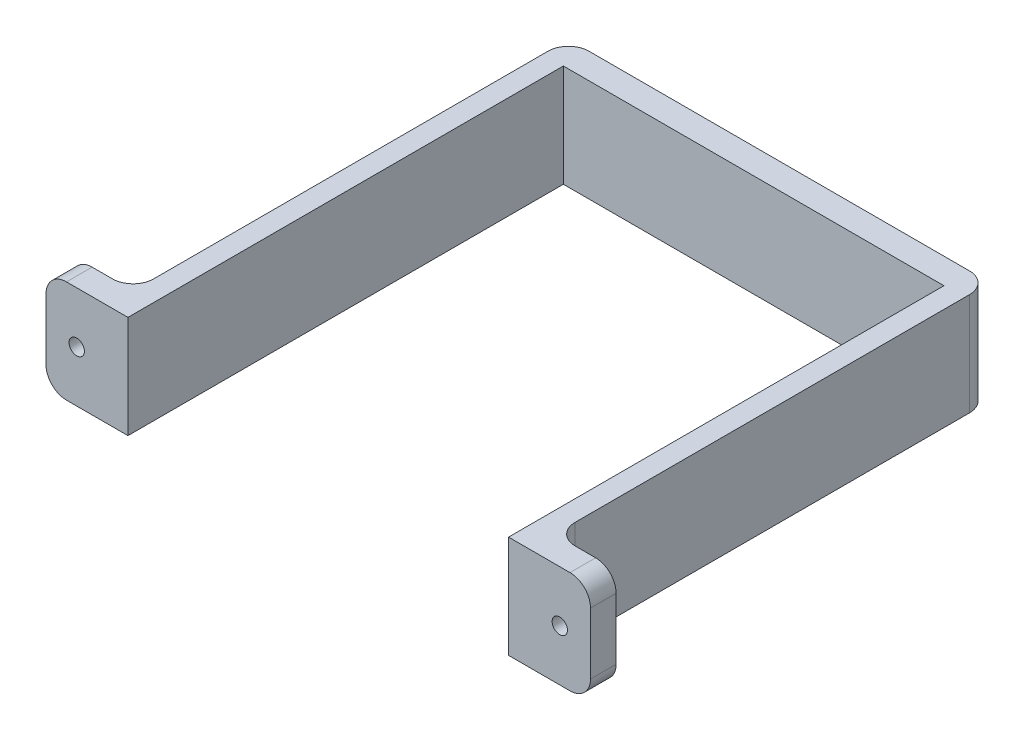
ISO-10303-21;
HEADER;
FILE_DESCRIPTION(('STEP AP214'),'2;1');
FILE_NAME('part.step','',(''),(''),'','','');
FILE_SCHEMA(('AUTOMOTIVE_DESIGN { 1 0 10303 214 1 1 1 1 }'));
ENDSEC;
DATA;
#1=APPLICATION_CONTEXT('core data for automotive mechanical design processes');
#2=APPLICATION_PROTOCOL_DEFINITION('international standard','automotive_design',2000,#1);
#3=PRODUCT_CONTEXT('',#1,'mechanical');
#4=PRODUCT('Part','Part','',(#3));
#5=PRODUCT_RELATED_PRODUCT_CATEGORY('part','',(#4));
#6=PRODUCT_DEFINITION_FORMATION('','',#4);
#7=PRODUCT_DEFINITION_CONTEXT('part definition',#1,'design');
#8=PRODUCT_DEFINITION('design','',#6,#7);
#9=PRODUCT_DEFINITION_SHAPE('','',#8);
#10=(LENGTH_UNIT() NAMED_UNIT(*) SI_UNIT(.MILLI.,.METRE.));
#11=(NAMED_UNIT(*) PLANE_ANGLE_UNIT() SI_UNIT($,.RADIAN.));
#12=(NAMED_UNIT(*) SI_UNIT($,.STERADIAN.) SOLID_ANGLE_UNIT());
#13=UNCERTAINTY_MEASURE_WITH_UNIT(LENGTH_MEASURE(1.E-05),#10,'distance_accuracy_value','');
#14=(GEOMETRIC_REPRESENTATION_CONTEXT(3) GLOBAL_UNCERTAINTY_ASSIGNED_CONTEXT((#13)) GLOBAL_UNIT_ASSIGNED_CONTEXT((#10,
#11,#12)) REPRESENTATION_CONTEXT('',''));
#15=CARTESIAN_POINT('',(0.,0.,0.));
#16=DIRECTION('',(0.,0.,1.));
#17=DIRECTION('',(1.,0.,0.));
#18=AXIS2_PLACEMENT_3D('',#15,#16,#17);
#19=CARTESIAN_POINT('',(-41.15,10.,0.));
#20=DIRECTION('',(1.,0.,0.));
#21=DIRECTION('',(0.,0.,-1.));
#22=AXIS2_PLACEMENT_3D('',#19,#20,#21);
#23=PLANE('',#22);
#24=DIRECTION('',(0.,0.,1.));
#25=VECTOR('',#24,1.);
#26=CARTESIAN_POINT('',(-41.15,10.,0.));
#27=LINE('',#26,#25);
#28=CARTESIAN_POINT('',(-41.15,10.,4.));
#29=VERTEX_POINT('',#28);
#30=CARTESIAN_POINT('',(-41.15,10.,81.));
#31=VERTEX_POINT('',#30);
#32=EDGE_CURVE('E207',#29,#31,#27,.T.);
#33=ORIENTED_EDGE('',*,*,#32,.F.);
#34=DIRECTION('',(0.,1.,0.));
#35=VECTOR('',#34,1.);
#36=CARTESIAN_POINT('',(-41.15,10.,4.));
#37=LINE('',#36,#35);
#38=CARTESIAN_POINT('',(-41.15,-10.,4.));
#39=VERTEX_POINT('',#38);
#40=EDGE_CURVE('E287',#29,#39,#37,.F.);
#41=ORIENTED_EDGE('',*,*,#40,.T.);
#42=DIRECTION('',(0.,0.,1.));
#43=VECTOR('',#42,1.);
#44=CARTESIAN_POINT('',(-41.15,-10.,0.));
#45=LINE('',#44,#43);
#46=CARTESIAN_POINT('',(-41.15,-10.,81.));
#47=VERTEX_POINT('',#46);
#48=EDGE_CURVE('E213',#39,#47,#45,.T.);
#49=ORIENTED_EDGE('',*,*,#48,.T.);
#50=DIRECTION('',(0.,-1.,0.));
#51=VECTOR('',#50,1.);
#52=CARTESIAN_POINT('',(-41.15,10.,81.));
#53=LINE('',#52,#51);
#54=EDGE_CURVE('E284',#47,#31,#53,.F.);
#55=ORIENTED_EDGE('',*,*,#54,.T.);
#56=EDGE_LOOP('',(#33,#41,#49,#55));
#57=FACE_BOUND('',#56,.T.);
#58=ADVANCED_FACE('F39',(#57),#23,.F.);
#59=CARTESIAN_POINT('',(41.15,10.,0.));
#60=DIRECTION('',(-1.,0.,0.));
#61=DIRECTION('',(0.,0.,1.));
#62=AXIS2_PLACEMENT_3D('',#59,#60,#61);
#63=PLANE('',#62);
#64=DIRECTION('',(0.,0.,1.));
#65=VECTOR('',#64,1.);
#66=CARTESIAN_POINT('',(41.15,-10.,0.));
#67=LINE('',#66,#65);
#68=CARTESIAN_POINT('',(41.15,-10.,4.));
#69=VERTEX_POINT('',#68);
#70=CARTESIAN_POINT('',(41.15,-10.,81.));
#71=VERTEX_POINT('',#70);
#72=EDGE_CURVE('E248',#69,#71,#67,.T.);
#73=ORIENTED_EDGE('',*,*,#72,.F.);
#74=DIRECTION('',(0.,-1.,0.));
#75=VECTOR('',#74,1.);
#76=CARTESIAN_POINT('',(41.15,10.,4.));
#77=LINE('',#76,#75);
#78=CARTESIAN_POINT('',(41.15,10.,4.));
#79=VERTEX_POINT('',#78);
#80=EDGE_CURVE('E329',#69,#79,#77,.F.);
#81=ORIENTED_EDGE('',*,*,#80,.T.);
#82=DIRECTION('',(0.,0.,1.));
#83=VECTOR('',#82,1.);
#84=CARTESIAN_POINT('',(41.15,10.,0.));
#85=LINE('',#84,#83);
#86=CARTESIAN_POINT('',(41.15,10.,81.));
#87=VERTEX_POINT('',#86);
#88=EDGE_CURVE('E244',#79,#87,#85,.T.);
#89=ORIENTED_EDGE('',*,*,#88,.T.);
#90=DIRECTION('',(0.,1.,0.));
#91=VECTOR('',#90,1.);
#92=CARTESIAN_POINT('',(41.15,-10.,81.));
#93=LINE('',#92,#91);
#94=EDGE_CURVE('E326',#87,#71,#93,.F.);
#95=ORIENTED_EDGE('',*,*,#94,.T.);
#96=EDGE_LOOP('',(#73,#81,#89,#95));
#97=FACE_BOUND('',#96,.T.);
#98=ADVANCED_FACE('F368',(#97),#63,.F.);
#99=CARTESIAN_POINT('',(0.,0.,5.));
#100=DIRECTION('',(0.,0.,1.));
#101=DIRECTION('',(1.,0.,0.));
#102=AXIS2_PLACEMENT_3D('',#99,#100,#101);
#103=PLANE('',#102);
#104=DIRECTION('',(-1.,0.,0.));
#105=VECTOR('',#104,1.);
#106=CARTESIAN_POINT('',(-37.15,10.,5.));
#107=LINE('',#106,#105);
#108=CARTESIAN_POINT('',(37.15,10.,5.));
#109=VERTEX_POINT('',#108);
#110=CARTESIAN_POINT('',(-37.15,10.,5.));
#111=VERTEX_POINT('',#110);
#112=EDGE_CURVE('E253',#109,#111,#107,.T.);
#113=ORIENTED_EDGE('',*,*,#112,.T.);
#114=DIRECTION('',(0.,1.,0.));
#115=VECTOR('',#114,1.);
#116=CARTESIAN_POINT('',(-37.15,-10.,5.));
#117=LINE('',#116,#115);
#118=CARTESIAN_POINT('',(-37.15,-10.,5.));
#119=VERTEX_POINT('',#118);
#120=EDGE_CURVE('E201',#119,#111,#117,.T.);
#121=ORIENTED_EDGE('',*,*,#120,.F.);
#122=DIRECTION('',(1.,0.,0.));
#123=VECTOR('',#122,1.);
#124=CARTESIAN_POINT('',(-37.15,-10.,5.));
#125=LINE('',#124,#123);
#126=CARTESIAN_POINT('',(37.15,-10.,5.));
#127=VERTEX_POINT('',#126);
#128=EDGE_CURVE('E256',#119,#127,#125,.T.);
#129=ORIENTED_EDGE('',*,*,#128,.T.);
#130=DIRECTION('',(0.,-1.,0.));
#131=VECTOR('',#130,1.);
#132=CARTESIAN_POINT('',(37.15,10.,5.));
#133=LINE('',#132,#131);
#134=EDGE_CURVE('E221',#109,#127,#133,.T.);
#135=ORIENTED_EDGE('',*,*,#134,.F.);
#136=EDGE_LOOP('',(#113,#121,#129,#135));
#137=FACE_BOUND('',#136,.T.);
#138=ADVANCED_FACE('F446',(#137),#103,.T.);
#139=CARTESIAN_POINT('',(-37.15,10.,5.));
#140=DIRECTION('',(0.,-1.,0.));
#141=DIRECTION('',(0.,0.,-1.));
#142=AXIS2_PLACEMENT_3D('',#139,#140,#141);
#143=PLANE('',#142);
#144=DIRECTION('',(-1.,0.,0.));
#145=VECTOR('',#144,1.);
#146=CARTESIAN_POINT('',(-37.15,10.,0.));
#147=LINE('',#146,#145);
#148=CARTESIAN_POINT('',(37.15,10.,0.));
#149=VERTEX_POINT('',#148);
#150=CARTESIAN_POINT('',(-37.15,10.,0.));
#151=VERTEX_POINT('',#150);
#152=EDGE_CURVE('E252',#149,#151,#147,.T.);
#153=ORIENTED_EDGE('',*,*,#152,.T.);
#154=CARTESIAN_POINT('',(-37.15,10.,4.));
#155=DIRECTION('',(0.,-1.,0.));
#156=DIRECTION('',(0.,0.,-1.));
#157=AXIS2_PLACEMENT_3D('',#154,#155,#156);
#158=CIRCLE('',#157,4.);
#159=EDGE_CURVE('E281',#151,#29,#158,.F.);
#160=ORIENTED_EDGE('',*,*,#159,.T.);
#161=ORIENTED_EDGE('',*,*,#32,.T.);
#162=CARTESIAN_POINT('',(-45.15,10.,81.));
#163=DIRECTION('',(0.,-1.,0.));
#164=DIRECTION('',(0.,0.,-1.));
#165=AXIS2_PLACEMENT_3D('',#162,#163,#164);
#166=CIRCLE('',#165,4.);
#167=CARTESIAN_POINT('',(-45.15,10.,85.));
#168=VERTEX_POINT('',#167);
#169=EDGE_CURVE('E356',#31,#168,#166,.T.);
#170=ORIENTED_EDGE('',*,*,#169,.T.);
#171=DIRECTION('',(1.,0.,0.));
#172=VECTOR('',#171,1.);
#173=CARTESIAN_POINT('',(-53.15,10.,85.));
#174=LINE('',#173,#172);
#175=CARTESIAN_POINT('',(-49.15,10.,85.));
#176=VERTEX_POINT('',#175);
#177=EDGE_CURVE('E398',#176,#168,#174,.T.);
#178=ORIENTED_EDGE('',*,*,#177,.F.);
#179=DIRECTION('',(0.,0.,-1.));
#180=VECTOR('',#179,1.);
#181=CARTESIAN_POINT('',(-49.15,10.,5.));
#182=LINE('',#181,#180);
#183=CARTESIAN_POINT('',(-49.15,10.,90.));
#184=VERTEX_POINT('',#183);
#185=EDGE_CURVE('E188',#176,#184,#182,.F.);
#186=ORIENTED_EDGE('',*,*,#185,.T.);
#187=DIRECTION('',(-1.,0.,0.));
#188=VECTOR('',#187,1.);
#189=CARTESIAN_POINT('',(-37.15,10.,90.));
#190=LINE('',#189,#188);
#191=CARTESIAN_POINT('',(-37.15,10.,90.));
#192=VERTEX_POINT('',#191);
#193=EDGE_CURVE('E178',#192,#184,#190,.T.);
#194=ORIENTED_EDGE('',*,*,#193,.F.);
#195=DIRECTION('',(0.,0.,-1.));
#196=VECTOR('',#195,1.);
#197=CARTESIAN_POINT('',(-37.15,10.,90.));
#198=LINE('',#197,#196);
#199=EDGE_CURVE('E184',#192,#111,#198,.T.);
#200=ORIENTED_EDGE('',*,*,#199,.T.);
#201=ORIENTED_EDGE('',*,*,#112,.F.);
#202=DIRECTION('',(0.,0.,-1.));
#203=VECTOR('',#202,1.);
#204=CARTESIAN_POINT('',(37.15,10.,90.));
#205=LINE('',#204,#203);
#206=CARTESIAN_POINT('',(37.15,10.,90.));
#207=VERTEX_POINT('',#206);
#208=EDGE_CURVE('E233',#207,#109,#205,.T.);
#209=ORIENTED_EDGE('',*,*,#208,.F.);
#210=DIRECTION('',(-1.,0.,0.));
#211=VECTOR('',#210,1.);
#212=CARTESIAN_POINT('',(37.15,10.,90.));
#213=LINE('',#212,#211);
#214=CARTESIAN_POINT('',(49.15,10.,90.));
#215=VERTEX_POINT('',#214);
#216=EDGE_CURVE('E230',#215,#207,#213,.T.);
#217=ORIENTED_EDGE('',*,*,#216,.F.);
#218=DIRECTION('',(0.,0.,1.));
#219=VECTOR('',#218,1.);
#220=CARTESIAN_POINT('',(49.15,10.,85.));
#221=LINE('',#220,#219);
#222=CARTESIAN_POINT('',(49.15,10.,85.));
#223=VERTEX_POINT('',#222);
#224=EDGE_CURVE('E273',#215,#223,#221,.F.);
#225=ORIENTED_EDGE('',*,*,#224,.T.);
#226=DIRECTION('',(-1.,0.,0.));
#227=VECTOR('',#226,1.);
#228=CARTESIAN_POINT('',(53.15,10.,85.));
#229=LINE('',#228,#227);
#230=CARTESIAN_POINT('',(45.15,10.,85.));
#231=VERTEX_POINT('',#230);
#232=EDGE_CURVE('E362',#223,#231,#229,.T.);
#233=ORIENTED_EDGE('',*,*,#232,.T.);
#234=CARTESIAN_POINT('',(45.15,10.,81.));
#235=DIRECTION('',(0.,-1.,0.));
#236=DIRECTION('',(0.,0.,-1.));
#237=AXIS2_PLACEMENT_3D('',#234,#235,#236);
#238=CIRCLE('',#237,4.);
#239=EDGE_CURVE('E48',#231,#87,#238,.T.);
#240=ORIENTED_EDGE('',*,*,#239,.T.);
#241=ORIENTED_EDGE('',*,*,#88,.F.);
#242=CARTESIAN_POINT('',(37.15,10.,4.));
#243=DIRECTION('',(0.,-1.,0.));
#244=DIRECTION('',(0.,0.,-1.));
#245=AXIS2_PLACEMENT_3D('',#242,#243,#244);
#246=CIRCLE('',#245,4.);
#247=EDGE_CURVE('E276',#79,#149,#246,.F.);
#248=ORIENTED_EDGE('',*,*,#247,.T.);
#249=EDGE_LOOP('',(#153,#160,#161,#170,#178,#186,#194,#200,#201,#209,#217,#225,#233,#240,#241,#248));
#250=FACE_BOUND('',#249,.T.);
#251=ADVANCED_FACE('F181',(#250),#143,.F.);
#252=CARTESIAN_POINT('',(-37.15,-10.,5.));
#253=DIRECTION('',(0.,1.,0.));
#254=DIRECTION('',(0.,0.,1.));
#255=AXIS2_PLACEMENT_3D('',#252,#253,#254);
#256=PLANE('',#255);
#257=ORIENTED_EDGE('',*,*,#48,.F.);
#258=CARTESIAN_POINT('',(-37.15,-10.,4.));
#259=DIRECTION('',(0.,1.,0.));
#260=DIRECTION('',(0.,0.,1.));
#261=AXIS2_PLACEMENT_3D('',#258,#259,#260);
#262=CIRCLE('',#261,4.);
#263=CARTESIAN_POINT('',(-37.15,-10.,0.));
#264=VERTEX_POINT('',#263);
#265=EDGE_CURVE('E299',#39,#264,#262,.F.);
#266=ORIENTED_EDGE('',*,*,#265,.T.);
#267=DIRECTION('',(1.,0.,0.));
#268=VECTOR('',#267,1.);
#269=CARTESIAN_POINT('',(-37.15,-10.,0.));
#270=LINE('',#269,#268);
#271=CARTESIAN_POINT('',(37.15,-10.,0.));
#272=VERTEX_POINT('',#271);
#273=EDGE_CURVE('E257',#264,#272,#270,.T.);
#274=ORIENTED_EDGE('',*,*,#273,.T.);
#275=CARTESIAN_POINT('',(37.15,-10.,4.));
#276=DIRECTION('',(0.,1.,0.));
#277=DIRECTION('',(0.,0.,1.));
#278=AXIS2_PLACEMENT_3D('',#275,#276,#277);
#279=CIRCLE('',#278,4.);
#280=EDGE_CURVE('E293',#272,#69,#279,.F.);
#281=ORIENTED_EDGE('',*,*,#280,.T.);
#282=ORIENTED_EDGE('',*,*,#72,.T.);
#283=CARTESIAN_POINT('',(45.15,-10.,81.));
#284=DIRECTION('',(0.,1.,0.));
#285=DIRECTION('',(0.,0.,1.));
#286=AXIS2_PLACEMENT_3D('',#283,#284,#285);
#287=CIRCLE('',#286,4.);
#288=CARTESIAN_POINT('',(45.15,-10.,85.));
#289=VERTEX_POINT('',#288);
#290=EDGE_CURVE('E11',#71,#289,#287,.T.);
#291=ORIENTED_EDGE('',*,*,#290,.T.);
#292=DIRECTION('',(-1.,0.,0.));
#293=VECTOR('',#292,1.);
#294=CARTESIAN_POINT('',(53.15,-10.,85.));
#295=LINE('',#294,#293);
#296=CARTESIAN_POINT('',(49.15,-10.,85.));
#297=VERTEX_POINT('',#296);
#298=EDGE_CURVE('E376',#297,#289,#295,.T.);
#299=ORIENTED_EDGE('',*,*,#298,.F.);
#300=DIRECTION('',(0.,0.,-1.));
#301=VECTOR('',#300,1.);
#302=CARTESIAN_POINT('',(49.15,-10.,90.));
#303=LINE('',#302,#301);
#304=CARTESIAN_POINT('',(49.15,-10.,90.));
#305=VERTEX_POINT('',#304);
#306=EDGE_CURVE('E290',#297,#305,#303,.F.);
#307=ORIENTED_EDGE('',*,*,#306,.T.);
#308=DIRECTION('',(1.,0.,0.));
#309=VECTOR('',#308,1.);
#310=CARTESIAN_POINT('',(37.15,-10.,90.));
#311=LINE('',#310,#309);
#312=CARTESIAN_POINT('',(37.15,-10.,90.));
#313=VERTEX_POINT('',#312);
#314=EDGE_CURVE('E226',#313,#305,#311,.T.);
#315=ORIENTED_EDGE('',*,*,#314,.F.);
#316=DIRECTION('',(0.,0.,-1.));
#317=VECTOR('',#316,1.);
#318=CARTESIAN_POINT('',(37.15,-10.,90.));
#319=LINE('',#318,#317);
#320=EDGE_CURVE('E240',#313,#127,#319,.T.);
#321=ORIENTED_EDGE('',*,*,#320,.T.);
#322=ORIENTED_EDGE('',*,*,#128,.F.);
#323=DIRECTION('',(0.,0.,-1.));
#324=VECTOR('',#323,1.);
#325=CARTESIAN_POINT('',(-37.15,-10.,90.));
#326=LINE('',#325,#324);
#327=CARTESIAN_POINT('',(-37.15,-10.,90.));
#328=VERTEX_POINT('',#327);
#329=EDGE_CURVE('E208',#328,#119,#326,.T.);
#330=ORIENTED_EDGE('',*,*,#329,.F.);
#331=DIRECTION('',(1.,0.,0.));
#332=VECTOR('',#331,1.);
#333=CARTESIAN_POINT('',(-37.15,-10.,90.));
#334=LINE('',#333,#332);
#335=CARTESIAN_POINT('',(-49.15,-10.,90.));
#336=VERTEX_POINT('',#335);
#337=EDGE_CURVE('E192',#336,#328,#334,.T.);
#338=ORIENTED_EDGE('',*,*,#337,.F.);
#339=DIRECTION('',(0.,0.,1.));
#340=VECTOR('',#339,1.);
#341=CARTESIAN_POINT('',(-49.15,-10.,5.));
#342=LINE('',#341,#340);
#343=CARTESIAN_POINT('',(-49.15,-10.,85.));
#344=VERTEX_POINT('',#343);
#345=EDGE_CURVE('E296',#336,#344,#342,.F.);
#346=ORIENTED_EDGE('',*,*,#345,.T.);
#347=DIRECTION('',(1.,0.,0.));
#348=VECTOR('',#347,1.);
#349=CARTESIAN_POINT('',(-53.15,-10.,85.));
#350=LINE('',#349,#348);
#351=CARTESIAN_POINT('',(-45.15,-10.,85.));
#352=VERTEX_POINT('',#351);
#353=EDGE_CURVE('E405',#344,#352,#350,.T.);
#354=ORIENTED_EDGE('',*,*,#353,.T.);
#355=CARTESIAN_POINT('',(-45.15,-10.,81.));
#356=DIRECTION('',(0.,1.,0.));
#357=DIRECTION('',(0.,0.,1.));
#358=AXIS2_PLACEMENT_3D('',#355,#356,#357);
#359=CIRCLE('',#358,4.);
#360=EDGE_CURVE('E353',#352,#47,#359,.T.);
#361=ORIENTED_EDGE('',*,*,#360,.T.);
#362=EDGE_LOOP('',(#257,#266,#274,#281,#282,#291,#299,#307,#315,#321,#322,#330,#338,#346,#354,#361));
#363=FACE_BOUND('',#362,.T.);
#364=ADVANCED_FACE('F375',(#363),#256,.F.);
#365=CARTESIAN_POINT('',(0.,0.,0.));
#366=DIRECTION('',(0.,0.,1.));
#367=DIRECTION('',(1.,0.,0.));
#368=AXIS2_PLACEMENT_3D('',#365,#366,#367);
#369=PLANE('',#368);
#370=ORIENTED_EDGE('',*,*,#273,.F.);
#371=DIRECTION('',(0.,1.,0.));
#372=VECTOR('',#371,1.);
#373=CARTESIAN_POINT('',(-37.15,0.,0.));
#374=LINE('',#373,#372);
#375=EDGE_CURVE('E269',#264,#151,#374,.T.);
#376=ORIENTED_EDGE('',*,*,#375,.T.);
#377=ORIENTED_EDGE('',*,*,#152,.F.);
#378=DIRECTION('',(0.,-1.,0.));
#379=VECTOR('',#378,1.);
#380=CARTESIAN_POINT('',(37.15,0.,0.));
#381=LINE('',#380,#379);
#382=EDGE_CURVE('E260',#149,#272,#381,.T.);
#383=ORIENTED_EDGE('',*,*,#382,.T.);
#384=EDGE_LOOP('',(#370,#376,#377,#383));
#385=FACE_BOUND('',#384,.T.);
#386=ADVANCED_FACE('F455',(#385),#369,.F.);
#387=CARTESIAN_POINT('',(37.15,10.,90.));
#388=DIRECTION('',(1.,0.,0.));
#389=DIRECTION('',(0.,0.,-1.));
#390=AXIS2_PLACEMENT_3D('',#387,#388,#389);
#391=PLANE('',#390);
#392=ORIENTED_EDGE('',*,*,#134,.T.);
#393=ORIENTED_EDGE('',*,*,#320,.F.);
#394=DIRECTION('',(0.,-1.,0.));
#395=VECTOR('',#394,1.);
#396=CARTESIAN_POINT('',(37.15,10.,90.));
#397=LINE('',#396,#395);
#398=EDGE_CURVE('E222',#207,#313,#397,.T.);
#399=ORIENTED_EDGE('',*,*,#398,.F.);
#400=ORIENTED_EDGE('',*,*,#208,.T.);
#401=EDGE_LOOP('',(#392,#393,#399,#400));
#402=FACE_BOUND('',#401,.T.);
#403=ADVANCED_FACE('F452',(#402),#391,.F.);
#404=CARTESIAN_POINT('',(0.,0.,90.));
#405=DIRECTION('',(0.,0.,1.));
#406=DIRECTION('',(1.,0.,0.));
#407=AXIS2_PLACEMENT_3D('',#404,#405,#406);
#408=PLANE('',#407);
#409=CARTESIAN_POINT('',(47.15,0.,90.));
#410=DIRECTION('',(0.,0.,-1.));
#411=DIRECTION('',(-1.,0.,0.));
#412=AXIS2_PLACEMENT_3D('',#409,#410,#411);
#413=CIRCLE('',#412,1.5);
#414=CARTESIAN_POINT('',(45.65,0.,90.));
#415=VERTEX_POINT('',#414);
#416=EDGE_CURVE('E393',#415,#415,#413,.T.);
#417=ORIENTED_EDGE('',*,*,#416,.T.);
#418=EDGE_LOOP('',(#417));
#419=FACE_BOUND('',#418,.T.);
#420=DIRECTION('',(0.,-1.,0.));
#421=VECTOR('',#420,1.);
#422=CARTESIAN_POINT('',(53.15,10.,90.));
#423=LINE('',#422,#421);
#424=CARTESIAN_POINT('',(53.15,6.,90.));
#425=VERTEX_POINT('',#424);
#426=CARTESIAN_POINT('',(53.15,-6.,90.));
#427=VERTEX_POINT('',#426);
#428=EDGE_CURVE('E389',#425,#427,#423,.T.);
#429=ORIENTED_EDGE('',*,*,#428,.F.);
#430=CARTESIAN_POINT('',(49.15,6.,90.));
#431=DIRECTION('',(0.,0.,1.));
#432=DIRECTION('',(1.,0.,0.));
#433=AXIS2_PLACEMENT_3D('',#430,#431,#432);
#434=CIRCLE('',#433,4.);
#435=EDGE_CURVE('E342',#425,#215,#434,.T.);
#436=ORIENTED_EDGE('',*,*,#435,.T.);
#437=ORIENTED_EDGE('',*,*,#216,.T.);
#438=ORIENTED_EDGE('',*,*,#398,.T.);
#439=ORIENTED_EDGE('',*,*,#314,.T.);
#440=CARTESIAN_POINT('',(49.15,-6.,90.));
#441=DIRECTION('',(0.,0.,1.));
#442=DIRECTION('',(1.,0.,0.));
#443=AXIS2_PLACEMENT_3D('',#440,#441,#442);
#444=CIRCLE('',#443,4.);
#445=EDGE_CURVE('E339',#305,#427,#444,.T.);
#446=ORIENTED_EDGE('',*,*,#445,.T.);
#447=EDGE_LOOP('',(#429,#436,#437,#438,#439,#446));
#448=FACE_BOUND('',#447,.T.);
#449=ADVANCED_FACE('F438',(#419,#448),#408,.T.);
#450=CARTESIAN_POINT('',(-37.15,-10.,90.));
#451=DIRECTION('',(-1.,0.,0.));
#452=DIRECTION('',(0.,0.,1.));
#453=AXIS2_PLACEMENT_3D('',#450,#451,#452);
#454=PLANE('',#453);
#455=ORIENTED_EDGE('',*,*,#120,.T.);
#456=ORIENTED_EDGE('',*,*,#199,.F.);
#457=DIRECTION('',(0.,1.,0.));
#458=VECTOR('',#457,1.);
#459=CARTESIAN_POINT('',(-37.15,-10.,90.));
#460=LINE('',#459,#458);
#461=EDGE_CURVE('E193',#328,#192,#460,.T.);
#462=ORIENTED_EDGE('',*,*,#461,.F.);
#463=ORIENTED_EDGE('',*,*,#329,.T.);
#464=EDGE_LOOP('',(#455,#456,#462,#463));
#465=FACE_BOUND('',#464,.T.);
#466=ADVANCED_FACE('F203',(#465),#454,.F.);
#467=CARTESIAN_POINT('',(0.,0.,90.));
#468=DIRECTION('',(0.,0.,1.));
#469=DIRECTION('',(1.,0.,0.));
#470=AXIS2_PLACEMENT_3D('',#467,#468,#469);
#471=PLANE('',#470);
#472=CARTESIAN_POINT('',(-47.15,0.,90.));
#473=DIRECTION('',(0.,0.,1.));
#474=DIRECTION('',(1.,0.,0.));
#475=AXIS2_PLACEMENT_3D('',#472,#473,#474);
#476=CIRCLE('',#475,1.5);
#477=CARTESIAN_POINT('',(-45.65,0.,90.));
#478=VERTEX_POINT('',#477);
#479=EDGE_CURVE('E417',#478,#478,#476,.T.);
#480=ORIENTED_EDGE('',*,*,#479,.F.);
#481=EDGE_LOOP('',(#480));
#482=FACE_BOUND('',#481,.T.);
#483=ORIENTED_EDGE('',*,*,#193,.T.);
#484=CARTESIAN_POINT('',(-49.15,6.,90.));
#485=DIRECTION('',(0.,0.,1.));
#486=DIRECTION('',(1.,0.,0.));
#487=AXIS2_PLACEMENT_3D('',#484,#485,#486);
#488=CIRCLE('',#487,4.);
#489=CARTESIAN_POINT('',(-53.15,6.,90.));
#490=VERTEX_POINT('',#489);
#491=EDGE_CURVE('E323',#184,#490,#488,.T.);
#492=ORIENTED_EDGE('',*,*,#491,.T.);
#493=DIRECTION('',(0.,1.,0.));
#494=VECTOR('',#493,1.);
#495=CARTESIAN_POINT('',(-53.15,10.,90.));
#496=LINE('',#495,#494);
#497=CARTESIAN_POINT('',(-53.15,-6.,90.));
#498=VERTEX_POINT('',#497);
#499=EDGE_CURVE('E413',#498,#490,#496,.T.);
#500=ORIENTED_EDGE('',*,*,#499,.F.);
#501=CARTESIAN_POINT('',(-49.15,-6.,90.));
#502=DIRECTION('',(0.,0.,1.));
#503=DIRECTION('',(1.,0.,0.));
#504=AXIS2_PLACEMENT_3D('',#501,#502,#503);
#505=CIRCLE('',#504,4.);
#506=EDGE_CURVE('E320',#498,#336,#505,.T.);
#507=ORIENTED_EDGE('',*,*,#506,.T.);
#508=ORIENTED_EDGE('',*,*,#337,.T.);
#509=ORIENTED_EDGE('',*,*,#461,.T.);
#510=EDGE_LOOP('',(#483,#492,#500,#507,#508,#509));
#511=FACE_BOUND('',#510,.T.);
#512=ADVANCED_FACE('F196',(#482,#511),#471,.T.);
#513=CARTESIAN_POINT('',(53.15,10.,85.));
#514=DIRECTION('',(0.,0.,1.));
#515=DIRECTION('',(1.,0.,0.));
#516=AXIS2_PLACEMENT_3D('',#513,#514,#515);
#517=PLANE('',#516);
#518=CARTESIAN_POINT('',(47.15,0.,85.));
#519=DIRECTION('',(0.,0.,-1.));
#520=DIRECTION('',(-1.,0.,0.));
#521=AXIS2_PLACEMENT_3D('',#518,#519,#520);
#522=CIRCLE('',#521,1.5);
#523=CARTESIAN_POINT('',(45.65,0.,85.));
#524=VERTEX_POINT('',#523);
#525=EDGE_CURVE('E394',#524,#524,#522,.T.);
#526=ORIENTED_EDGE('',*,*,#525,.F.);
#527=EDGE_LOOP('',(#526));
#528=FACE_BOUND('',#527,.T.);
#529=ORIENTED_EDGE('',*,*,#232,.F.);
#530=CARTESIAN_POINT('',(49.15,6.,85.));
#531=DIRECTION('',(0.,0.,1.));
#532=DIRECTION('',(1.,0.,0.));
#533=AXIS2_PLACEMENT_3D('',#530,#531,#532);
#534=CIRCLE('',#533,4.);
#535=CARTESIAN_POINT('',(53.15,6.,85.));
#536=VERTEX_POINT('',#535);
#537=EDGE_CURVE('E55',#223,#536,#534,.F.);
#538=ORIENTED_EDGE('',*,*,#537,.T.);
#539=DIRECTION('',(0.,1.,0.));
#540=VECTOR('',#539,1.);
#541=CARTESIAN_POINT('',(53.15,10.,85.));
#542=LINE('',#541,#540);
#543=CARTESIAN_POINT('',(53.15,-6.,85.));
#544=VERTEX_POINT('',#543);
#545=EDGE_CURVE('E382',#544,#536,#542,.T.);
#546=ORIENTED_EDGE('',*,*,#545,.F.);
#547=CARTESIAN_POINT('',(49.15,-6.,85.));
#548=DIRECTION('',(0.,0.,1.));
#549=DIRECTION('',(1.,0.,0.));
#550=AXIS2_PLACEMENT_3D('',#547,#548,#549);
#551=CIRCLE('',#550,4.);
#552=EDGE_CURVE('E63',#544,#297,#551,.F.);
#553=ORIENTED_EDGE('',*,*,#552,.T.);
#554=ORIENTED_EDGE('',*,*,#298,.T.);
#555=DIRECTION('',(0.,1.,0.));
#556=VECTOR('',#555,1.);
#557=CARTESIAN_POINT('',(45.15,10.,85.));
#558=LINE('',#557,#556);
#559=EDGE_CURVE('E345',#289,#231,#558,.T.);
#560=ORIENTED_EDGE('',*,*,#559,.T.);
#561=EDGE_LOOP('',(#529,#538,#546,#553,#554,#560));
#562=FACE_BOUND('',#561,.T.);
#563=ADVANCED_FACE('F377',(#528,#562),#517,.F.);
#564=CARTESIAN_POINT('',(53.15,0.,0.));
#565=DIRECTION('',(1.,0.,0.));
#566=DIRECTION('',(0.,0.,-1.));
#567=AXIS2_PLACEMENT_3D('',#564,#565,#566);
#568=PLANE('',#567);
#569=ORIENTED_EDGE('',*,*,#545,.T.);
#570=DIRECTION('',(0.,0.,1.));
#571=VECTOR('',#570,1.);
#572=CARTESIAN_POINT('',(53.15,6.,90.));
#573=LINE('',#572,#571);
#574=EDGE_CURVE('E335',#536,#425,#573,.T.);
#575=ORIENTED_EDGE('',*,*,#574,.T.);
#576=ORIENTED_EDGE('',*,*,#428,.T.);
#577=DIRECTION('',(0.,0.,-1.));
#578=VECTOR('',#577,1.);
#579=CARTESIAN_POINT('',(53.15,-6.,85.));
#580=LINE('',#579,#578);
#581=EDGE_CURVE('E332',#427,#544,#580,.T.);
#582=ORIENTED_EDGE('',*,*,#581,.T.);
#583=EDGE_LOOP('',(#569,#575,#576,#582));
#584=FACE_BOUND('',#583,.T.);
#585=ADVANCED_FACE('F435',(#584),#568,.T.);
#586=CARTESIAN_POINT('',(47.15,0.,90.));
#587=DIRECTION('',(0.,0.,-1.));
#588=DIRECTION('',(-1.,0.,0.));
#589=AXIS2_PLACEMENT_3D('',#586,#587,#588);
#590=CYLINDRICAL_SURFACE('',#589,1.5);
#591=ORIENTED_EDGE('',*,*,#416,.F.);
#592=EDGE_LOOP('',(#591));
#593=FACE_BOUND('',#592,.T.);
#594=ORIENTED_EDGE('',*,*,#525,.T.);
#595=EDGE_LOOP('',(#594));
#596=FACE_BOUND('',#595,.T.);
#597=ADVANCED_FACE('F534',(#593,#596),#590,.F.);
#598=CARTESIAN_POINT('',(-53.15,10.,85.));
#599=DIRECTION('',(0.,0.,1.));
#600=DIRECTION('',(1.,0.,0.));
#601=AXIS2_PLACEMENT_3D('',#598,#599,#600);
#602=PLANE('',#601);
#603=CARTESIAN_POINT('',(-47.15,0.,85.));
#604=DIRECTION('',(0.,0.,1.));
#605=DIRECTION('',(1.,0.,0.));
#606=AXIS2_PLACEMENT_3D('',#603,#604,#605);
#607=CIRCLE('',#606,1.5);
#608=CARTESIAN_POINT('',(-45.65,0.,85.));
#609=VERTEX_POINT('',#608);
#610=EDGE_CURVE('E418',#609,#609,#607,.T.);
#611=ORIENTED_EDGE('',*,*,#610,.T.);
#612=EDGE_LOOP('',(#611));
#613=FACE_BOUND('',#612,.T.);
#614=DIRECTION('',(0.,-1.,0.));
#615=VECTOR('',#614,1.);
#616=CARTESIAN_POINT('',(-53.15,10.,85.));
#617=LINE('',#616,#615);
#618=CARTESIAN_POINT('',(-53.15,6.,85.));
#619=VERTEX_POINT('',#618);
#620=CARTESIAN_POINT('',(-53.15,-6.,85.));
#621=VERTEX_POINT('',#620);
#622=EDGE_CURVE('E409',#619,#621,#617,.T.);
#623=ORIENTED_EDGE('',*,*,#622,.F.);
#624=CARTESIAN_POINT('',(-49.15,6.,85.));
#625=DIRECTION('',(0.,0.,1.));
#626=DIRECTION('',(1.,0.,0.));
#627=AXIS2_PLACEMENT_3D('',#624,#625,#626);
#628=CIRCLE('',#627,4.);
#629=EDGE_CURVE('E317',#619,#176,#628,.F.);
#630=ORIENTED_EDGE('',*,*,#629,.T.);
#631=ORIENTED_EDGE('',*,*,#177,.T.);
#632=DIRECTION('',(0.,-1.,0.));
#633=VECTOR('',#632,1.);
#634=CARTESIAN_POINT('',(-45.15,-10.,85.));
#635=LINE('',#634,#633);
#636=EDGE_CURVE('E310',#168,#352,#635,.T.);
#637=ORIENTED_EDGE('',*,*,#636,.T.);
#638=ORIENTED_EDGE('',*,*,#353,.F.);
#639=CARTESIAN_POINT('',(-49.15,-6.,85.));
#640=DIRECTION('',(0.,0.,1.));
#641=DIRECTION('',(1.,0.,0.));
#642=AXIS2_PLACEMENT_3D('',#639,#640,#641);
#643=CIRCLE('',#642,4.);
#644=EDGE_CURVE('E314',#344,#621,#643,.F.);
#645=ORIENTED_EDGE('',*,*,#644,.T.);
#646=EDGE_LOOP('',(#623,#630,#631,#637,#638,#645));
#647=FACE_BOUND('',#646,.T.);
#648=ADVANCED_FACE('F513',(#613,#647),#602,.F.);
#649=CARTESIAN_POINT('',(-53.15,0.,0.));
#650=DIRECTION('',(1.,0.,0.));
#651=DIRECTION('',(0.,0.,-1.));
#652=AXIS2_PLACEMENT_3D('',#649,#650,#651);
#653=PLANE('',#652);
#654=ORIENTED_EDGE('',*,*,#499,.T.);
#655=DIRECTION('',(0.,0.,-1.));
#656=VECTOR('',#655,1.);
#657=CARTESIAN_POINT('',(-53.15,6.,0.));
#658=LINE('',#657,#656);
#659=EDGE_CURVE('E306',#490,#619,#658,.T.);
#660=ORIENTED_EDGE('',*,*,#659,.T.);
#661=ORIENTED_EDGE('',*,*,#622,.T.);
#662=DIRECTION('',(0.,0.,1.));
#663=VECTOR('',#662,1.);
#664=CARTESIAN_POINT('',(-53.15,-6.,0.));
#665=LINE('',#664,#663);
#666=EDGE_CURVE('E302',#621,#498,#665,.T.);
#667=ORIENTED_EDGE('',*,*,#666,.T.);
#668=EDGE_LOOP('',(#654,#660,#661,#667));
#669=FACE_BOUND('',#668,.T.);
#670=ADVANCED_FACE('F515',(#669),#653,.F.);
#671=CARTESIAN_POINT('',(-47.15,0.,90.));
#672=DIRECTION('',(0.,0.,-1.));
#673=DIRECTION('',(-1.,0.,0.));
#674=AXIS2_PLACEMENT_3D('',#671,#672,#673);
#675=CYLINDRICAL_SURFACE('',#674,1.5);
#676=ORIENTED_EDGE('',*,*,#479,.T.);
#677=EDGE_LOOP('',(#676));
#678=FACE_BOUND('',#677,.T.);
#679=ORIENTED_EDGE('',*,*,#610,.F.);
#680=EDGE_LOOP('',(#679));
#681=FACE_BOUND('',#680,.T.);
#682=ADVANCED_FACE('F426',(#678,#681),#675,.F.);
#683=CARTESIAN_POINT('',(-37.15,0.,4.));
#684=DIRECTION('',(0.,1.,0.));
#685=DIRECTION('',(0.,0.,1.));
#686=AXIS2_PLACEMENT_3D('',#683,#684,#685);
#687=CYLINDRICAL_SURFACE('',#686,4.);
#688=ORIENTED_EDGE('',*,*,#265,.F.);
#689=ORIENTED_EDGE('',*,*,#40,.F.);
#690=ORIENTED_EDGE('',*,*,#159,.F.);
#691=ORIENTED_EDGE('',*,*,#375,.F.);
#692=EDGE_LOOP('',(#688,#689,#690,#691));
#693=FACE_BOUND('',#692,.T.);
#694=ADVANCED_FACE('F468',(#693),#687,.T.);
#695=CARTESIAN_POINT('',(-49.15,6.,0.));
#696=DIRECTION('',(0.,0.,-1.));
#697=DIRECTION('',(-1.,0.,0.));
#698=AXIS2_PLACEMENT_3D('',#695,#696,#697);
#699=CYLINDRICAL_SURFACE('',#698,4.);
#700=ORIENTED_EDGE('',*,*,#491,.F.);
#701=ORIENTED_EDGE('',*,*,#185,.F.);
#702=ORIENTED_EDGE('',*,*,#629,.F.);
#703=ORIENTED_EDGE('',*,*,#659,.F.);
#704=EDGE_LOOP('',(#700,#701,#702,#703));
#705=FACE_BOUND('',#704,.T.);
#706=ADVANCED_FACE('F471',(#705),#699,.T.);
#707=CARTESIAN_POINT('',(-49.15,-6.,0.));
#708=DIRECTION('',(0.,0.,1.));
#709=DIRECTION('',(1.,0.,0.));
#710=AXIS2_PLACEMENT_3D('',#707,#708,#709);
#711=CYLINDRICAL_SURFACE('',#710,4.);
#712=ORIENTED_EDGE('',*,*,#644,.F.);
#713=ORIENTED_EDGE('',*,*,#345,.F.);
#714=ORIENTED_EDGE('',*,*,#506,.F.);
#715=ORIENTED_EDGE('',*,*,#666,.F.);
#716=EDGE_LOOP('',(#712,#713,#714,#715));
#717=FACE_BOUND('',#716,.T.);
#718=ADVANCED_FACE('F475',(#717),#711,.T.);
#719=CARTESIAN_POINT('',(-45.15,10.,81.));
#720=DIRECTION('',(0.,1.,0.));
#721=DIRECTION('',(0.,0.,1.));
#722=AXIS2_PLACEMENT_3D('',#719,#720,#721);
#723=CYLINDRICAL_SURFACE('',#722,4.);
#724=ORIENTED_EDGE('',*,*,#169,.F.);
#725=ORIENTED_EDGE('',*,*,#54,.F.);
#726=ORIENTED_EDGE('',*,*,#360,.F.);
#727=ORIENTED_EDGE('',*,*,#636,.F.);
#728=EDGE_LOOP('',(#724,#725,#726,#727));
#729=FACE_BOUND('',#728,.T.);
#730=ADVANCED_FACE('F479',(#729),#723,.F.);
#731=CARTESIAN_POINT('',(37.15,0.,4.));
#732=DIRECTION('',(0.,-1.,0.));
#733=DIRECTION('',(0.,0.,-1.));
#734=AXIS2_PLACEMENT_3D('',#731,#732,#733);
#735=CYLINDRICAL_SURFACE('',#734,4.);
#736=ORIENTED_EDGE('',*,*,#247,.F.);
#737=ORIENTED_EDGE('',*,*,#80,.F.);
#738=ORIENTED_EDGE('',*,*,#280,.F.);
#739=ORIENTED_EDGE('',*,*,#382,.F.);
#740=EDGE_LOOP('',(#736,#737,#738,#739));
#741=FACE_BOUND('',#740,.T.);
#742=ADVANCED_FACE('F483',(#741),#735,.T.);
#743=CARTESIAN_POINT('',(49.15,6.,0.));
#744=DIRECTION('',(0.,0.,-1.));
#745=DIRECTION('',(-1.,0.,0.));
#746=AXIS2_PLACEMENT_3D('',#743,#744,#745);
#747=CYLINDRICAL_SURFACE('',#746,4.);
#748=ORIENTED_EDGE('',*,*,#537,.F.);
#749=ORIENTED_EDGE('',*,*,#224,.F.);
#750=ORIENTED_EDGE('',*,*,#435,.F.);
#751=ORIENTED_EDGE('',*,*,#574,.F.);
#752=EDGE_LOOP('',(#748,#749,#750,#751));
#753=FACE_BOUND('',#752,.T.);
#754=ADVANCED_FACE('F487',(#753),#747,.T.);
#755=CARTESIAN_POINT('',(49.15,-6.,0.));
#756=DIRECTION('',(0.,0.,1.));
#757=DIRECTION('',(1.,0.,0.));
#758=AXIS2_PLACEMENT_3D('',#755,#756,#757);
#759=CYLINDRICAL_SURFACE('',#758,4.);
#760=ORIENTED_EDGE('',*,*,#445,.F.);
#761=ORIENTED_EDGE('',*,*,#306,.F.);
#762=ORIENTED_EDGE('',*,*,#552,.F.);
#763=ORIENTED_EDGE('',*,*,#581,.F.);
#764=EDGE_LOOP('',(#760,#761,#762,#763));
#765=FACE_BOUND('',#764,.T.);
#766=ADVANCED_FACE('F490',(#765),#759,.T.);
#767=CARTESIAN_POINT('',(45.15,10.,81.));
#768=DIRECTION('',(0.,-1.,0.));
#769=DIRECTION('',(0.,0.,-1.));
#770=AXIS2_PLACEMENT_3D('',#767,#768,#769);
#771=CYLINDRICAL_SURFACE('',#770,4.);
#772=ORIENTED_EDGE('',*,*,#290,.F.);
#773=ORIENTED_EDGE('',*,*,#94,.F.);
#774=ORIENTED_EDGE('',*,*,#239,.F.);
#775=ORIENTED_EDGE('',*,*,#559,.F.);
#776=EDGE_LOOP('',(#772,#773,#774,#775));
#777=FACE_BOUND('',#776,.T.);
#778=ADVANCED_FACE('F41',(#777),#771,.F.);
#779=CLOSED_SHELL('',(#58,#98,#138,#251,#364,#386,#403,#449,#466,#512,#563,#585,#597,#648,#670,
#682,#694,#706,#718,#730,#742,#754,#766,#778));
#780=MANIFOLD_SOLID_BREP('B2',#779);
#781=ADVANCED_BREP_SHAPE_REPRESENTATION('',(#18,#780),#14);
#782=SHAPE_DEFINITION_REPRESENTATION(#9,#781);
ENDSEC;
END-ISO-10303-21;
